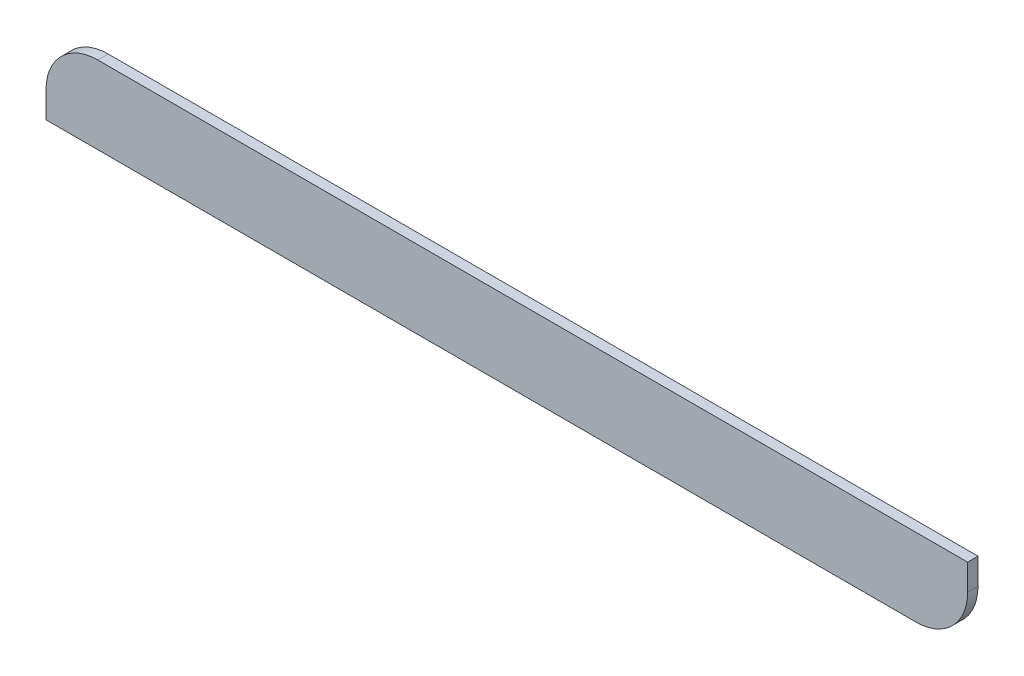
ISO-10303-21;
HEADER;
FILE_DESCRIPTION(('STEP AP214'),'2;1');
FILE_NAME('part.step','',(''),(''),'','','');
FILE_SCHEMA(('AUTOMOTIVE_DESIGN { 1 0 10303 214 1 1 1 1 }'));
ENDSEC;
DATA;
#1=APPLICATION_CONTEXT('core data for automotive mechanical design processes');
#2=APPLICATION_PROTOCOL_DEFINITION('international standard','automotive_design',2000,#1);
#3=PRODUCT_CONTEXT('',#1,'mechanical');
#4=PRODUCT('Part','Part','',(#3));
#5=PRODUCT_RELATED_PRODUCT_CATEGORY('part','',(#4));
#6=PRODUCT_DEFINITION_FORMATION('','',#4);
#7=PRODUCT_DEFINITION_CONTEXT('part definition',#1,'design');
#8=PRODUCT_DEFINITION('design','',#6,#7);
#9=PRODUCT_DEFINITION_SHAPE('','',#8);
#10=(LENGTH_UNIT() NAMED_UNIT(*) SI_UNIT(.MILLI.,.METRE.));
#11=(NAMED_UNIT(*) PLANE_ANGLE_UNIT() SI_UNIT($,.RADIAN.));
#12=(NAMED_UNIT(*) SI_UNIT($,.STERADIAN.) SOLID_ANGLE_UNIT());
#13=UNCERTAINTY_MEASURE_WITH_UNIT(LENGTH_MEASURE(1.E-05),#10,'distance_accuracy_value','');
#14=(GEOMETRIC_REPRESENTATION_CONTEXT(3) GLOBAL_UNCERTAINTY_ASSIGNED_CONTEXT((#13)) GLOBAL_UNIT_ASSIGNED_CONTEXT((#10,
#11,#12)) REPRESENTATION_CONTEXT('',''));
#15=CARTESIAN_POINT('',(0.,0.,0.));
#16=DIRECTION('',(0.,0.,1.));
#17=DIRECTION('',(1.,0.,0.));
#18=AXIS2_PLACEMENT_3D('',#15,#16,#17);
#19=CARTESIAN_POINT('',(-160.973915688566,-16.8619186731065,2.));
#20=DIRECTION('',(0.,0.,-1.));
#21=DIRECTION('',(-1.,0.,0.));
#22=AXIS2_PLACEMENT_3D('',#19,#20,#21);
#23=CYLINDRICAL_SURFACE('',#22,10.);
#24=CARTESIAN_POINT('',(-160.973915688566,-16.8619186731065,0.));
#25=DIRECTION('',(0.,0.,1.));
#26=DIRECTION('',(1.,0.,0.));
#27=AXIS2_PLACEMENT_3D('',#24,#25,#26);
#28=CIRCLE('',#27,10.);
#29=CARTESIAN_POINT('',(-160.973915688566,-6.86191867310647,0.));
#30=VERTEX_POINT('',#29);
#31=CARTESIAN_POINT('',(-170.973915688566,-16.8619186731065,0.));
#32=VERTEX_POINT('',#31);
#33=EDGE_CURVE('E119',#30,#32,#28,.T.);
#34=ORIENTED_EDGE('',*,*,#33,.T.);
#35=DIRECTION('',(0.,0.,-1.));
#36=VECTOR('',#35,1.);
#37=CARTESIAN_POINT('',(-170.973915688566,-16.8619186731065,2.));
#38=LINE('',#37,#36);
#39=CARTESIAN_POINT('',(-170.973915688566,-16.8619186731065,2.));
#40=VERTEX_POINT('',#39);
#41=EDGE_CURVE('E11',#40,#32,#38,.T.);
#42=ORIENTED_EDGE('',*,*,#41,.F.);
#43=CARTESIAN_POINT('',(-160.973915688566,-16.8619186731065,2.));
#44=DIRECTION('',(0.,0.,1.));
#45=DIRECTION('',(1.,0.,0.));
#46=AXIS2_PLACEMENT_3D('',#43,#44,#45);
#47=CIRCLE('',#46,10.);
#48=CARTESIAN_POINT('',(-160.973915688566,-6.86191867310647,2.));
#49=VERTEX_POINT('',#48);
#50=EDGE_CURVE('E131',#49,#40,#47,.T.);
#51=ORIENTED_EDGE('',*,*,#50,.F.);
#52=DIRECTION('',(0.,0.,-1.));
#53=VECTOR('',#52,1.);
#54=CARTESIAN_POINT('',(-160.973915688566,-6.86191867310647,2.));
#55=LINE('',#54,#53);
#56=EDGE_CURVE('E50',#49,#30,#55,.T.);
#57=ORIENTED_EDGE('',*,*,#56,.T.);
#58=EDGE_LOOP('',(#34,#42,#51,#57));
#59=FACE_BOUND('',#58,.T.);
#60=ADVANCED_FACE('F34',(#59),#23,.T.);
#61=CARTESIAN_POINT('',(-170.973915688566,-16.8619186731065,2.));
#62=DIRECTION('',(1.,0.,0.));
#63=DIRECTION('',(0.,0.,-1.));
#64=AXIS2_PLACEMENT_3D('',#61,#62,#63);
#65=PLANE('',#64);
#66=DIRECTION('',(0.,-1.,0.));
#67=VECTOR('',#66,1.);
#68=CARTESIAN_POINT('',(-170.973915688566,-16.8619186731065,0.));
#69=LINE('',#68,#67);
#70=CARTESIAN_POINT('',(-170.973915688566,-21.8619186731065,0.));
#71=VERTEX_POINT('',#70);
#72=EDGE_CURVE('E121',#32,#71,#69,.T.);
#73=ORIENTED_EDGE('',*,*,#72,.T.);
#74=DIRECTION('',(0.,0.,-1.));
#75=VECTOR('',#74,1.);
#76=CARTESIAN_POINT('',(-170.973915688566,-21.8619186731065,2.));
#77=LINE('',#76,#75);
#78=CARTESIAN_POINT('',(-170.973915688566,-21.8619186731065,2.));
#79=VERTEX_POINT('',#78);
#80=EDGE_CURVE('E42',#79,#71,#77,.T.);
#81=ORIENTED_EDGE('',*,*,#80,.F.);
#82=DIRECTION('',(0.,-1.,0.));
#83=VECTOR('',#82,1.);
#84=CARTESIAN_POINT('',(-170.973915688566,-16.8619186731065,2.));
#85=LINE('',#84,#83);
#86=EDGE_CURVE('E82',#40,#79,#85,.T.);
#87=ORIENTED_EDGE('',*,*,#86,.F.);
#88=ORIENTED_EDGE('',*,*,#41,.T.);
#89=EDGE_LOOP('',(#73,#81,#87,#88));
#90=FACE_BOUND('',#89,.T.);
#91=ADVANCED_FACE('F151',(#90),#65,.F.);
#92=CARTESIAN_POINT('',(-170.973915688566,-21.8619186731065,2.));
#93=DIRECTION('',(0.,1.,0.));
#94=DIRECTION('',(0.,0.,1.));
#95=AXIS2_PLACEMENT_3D('',#92,#93,#94);
#96=PLANE('',#95);
#97=DIRECTION('',(1.,0.,0.));
#98=VECTOR('',#97,1.);
#99=CARTESIAN_POINT('',(-170.973915688566,-21.8619186731065,0.));
#100=LINE('',#99,#98);
#101=CARTESIAN_POINT('',(-3.17391568856599,-21.8619186731065,0.));
#102=VERTEX_POINT('',#101);
#103=EDGE_CURVE('E123',#71,#102,#100,.T.);
#104=ORIENTED_EDGE('',*,*,#103,.T.);
#105=DIRECTION('',(0.,0.,-1.));
#106=VECTOR('',#105,1.);
#107=CARTESIAN_POINT('',(-3.17391568856599,-21.8619186731065,2.));
#108=LINE('',#107,#106);
#109=CARTESIAN_POINT('',(-3.17391568856599,-21.8619186731065,2.));
#110=VERTEX_POINT('',#109);
#111=EDGE_CURVE('E111',#110,#102,#108,.T.);
#112=ORIENTED_EDGE('',*,*,#111,.F.);
#113=DIRECTION('',(1.,0.,0.));
#114=VECTOR('',#113,1.);
#115=CARTESIAN_POINT('',(-170.973915688566,-21.8619186731065,2.));
#116=LINE('',#115,#114);
#117=EDGE_CURVE('E99',#79,#110,#116,.T.);
#118=ORIENTED_EDGE('',*,*,#117,.F.);
#119=ORIENTED_EDGE('',*,*,#80,.T.);
#120=EDGE_LOOP('',(#104,#112,#118,#119));
#121=FACE_BOUND('',#120,.T.);
#122=ADVANCED_FACE('F137',(#121),#96,.F.);
#123=CARTESIAN_POINT('',(-3.17391568856592,-11.8619186731065,2.));
#124=DIRECTION('',(0.,0.,-1.));
#125=DIRECTION('',(-1.,0.,0.));
#126=AXIS2_PLACEMENT_3D('',#123,#124,#125);
#127=CYLINDRICAL_SURFACE('',#126,10.);
#128=CARTESIAN_POINT('',(-3.17391568856592,-11.8619186731065,0.));
#129=DIRECTION('',(0.,0.,1.));
#130=DIRECTION('',(1.,0.,0.));
#131=AXIS2_PLACEMENT_3D('',#128,#129,#130);
#132=CIRCLE('',#131,10.);
#133=CARTESIAN_POINT('',(6.82608431143408,-11.8619186731064,0.));
#134=VERTEX_POINT('',#133);
#135=EDGE_CURVE('E108',#102,#134,#132,.T.);
#136=ORIENTED_EDGE('',*,*,#135,.T.);
#137=DIRECTION('',(0.,0.,-1.));
#138=VECTOR('',#137,1.);
#139=CARTESIAN_POINT('',(6.82608431143408,-11.8619186731064,2.));
#140=LINE('',#139,#138);
#141=CARTESIAN_POINT('',(6.82608431143408,-11.8619186731064,2.));
#142=VERTEX_POINT('',#141);
#143=EDGE_CURVE('E105',#142,#134,#140,.T.);
#144=ORIENTED_EDGE('',*,*,#143,.F.);
#145=CARTESIAN_POINT('',(-3.17391568856592,-11.8619186731065,2.));
#146=DIRECTION('',(0.,0.,1.));
#147=DIRECTION('',(1.,0.,0.));
#148=AXIS2_PLACEMENT_3D('',#145,#146,#147);
#149=CIRCLE('',#148,10.);
#150=EDGE_CURVE('E92',#110,#142,#149,.T.);
#151=ORIENTED_EDGE('',*,*,#150,.F.);
#152=ORIENTED_EDGE('',*,*,#111,.T.);
#153=EDGE_LOOP('',(#136,#144,#151,#152));
#154=FACE_BOUND('',#153,.T.);
#155=ADVANCED_FACE('F106',(#154),#127,.T.);
#156=CARTESIAN_POINT('',(6.82608431143408,-6.86191867310647,2.));
#157=DIRECTION('',(1.,0.,0.));
#158=DIRECTION('',(0.,0.,-1.));
#159=AXIS2_PLACEMENT_3D('',#156,#157,#158);
#160=PLANE('',#159);
#161=DIRECTION('',(0.,-1.,0.));
#162=VECTOR('',#161,1.);
#163=CARTESIAN_POINT('',(6.82608431143408,-6.86191867310647,0.));
#164=LINE('',#163,#162);
#165=CARTESIAN_POINT('',(6.82608431143408,-6.86191867310647,0.));
#166=VERTEX_POINT('',#165);
#167=EDGE_CURVE('E126',#166,#134,#164,.T.);
#168=ORIENTED_EDGE('',*,*,#167,.F.);
#169=DIRECTION('',(0.,0.,-1.));
#170=VECTOR('',#169,1.);
#171=CARTESIAN_POINT('',(6.82608431143408,-6.86191867310647,2.));
#172=LINE('',#171,#170);
#173=CARTESIAN_POINT('',(6.82608431143408,-6.86191867310647,2.));
#174=VERTEX_POINT('',#173);
#175=EDGE_CURVE('E70',#174,#166,#172,.T.);
#176=ORIENTED_EDGE('',*,*,#175,.F.);
#177=DIRECTION('',(0.,-1.,0.));
#178=VECTOR('',#177,1.);
#179=CARTESIAN_POINT('',(6.82608431143408,-6.86191867310647,2.));
#180=LINE('',#179,#178);
#181=EDGE_CURVE('E97',#174,#142,#180,.T.);
#182=ORIENTED_EDGE('',*,*,#181,.T.);
#183=ORIENTED_EDGE('',*,*,#143,.T.);
#184=EDGE_LOOP('',(#168,#176,#182,#183));
#185=FACE_BOUND('',#184,.T.);
#186=ADVANCED_FACE('F113',(#185),#160,.T.);
#187=CARTESIAN_POINT('',(-160.973915688566,-6.86191867310647,2.));
#188=DIRECTION('',(0.,1.,0.));
#189=DIRECTION('',(0.,0.,1.));
#190=AXIS2_PLACEMENT_3D('',#187,#188,#189);
#191=PLANE('',#190);
#192=DIRECTION('',(1.,0.,0.));
#193=VECTOR('',#192,1.);
#194=CARTESIAN_POINT('',(-160.973915688566,-6.86191867310647,0.));
#195=LINE('',#194,#193);
#196=EDGE_CURVE('E128',#30,#166,#195,.T.);
#197=ORIENTED_EDGE('',*,*,#196,.F.);
#198=ORIENTED_EDGE('',*,*,#56,.F.);
#199=DIRECTION('',(1.,0.,0.));
#200=VECTOR('',#199,1.);
#201=CARTESIAN_POINT('',(-160.973915688566,-6.86191867310647,2.));
#202=LINE('',#201,#200);
#203=EDGE_CURVE('E114',#49,#174,#202,.T.);
#204=ORIENTED_EDGE('',*,*,#203,.T.);
#205=ORIENTED_EDGE('',*,*,#175,.T.);
#206=EDGE_LOOP('',(#197,#198,#204,#205));
#207=FACE_BOUND('',#206,.T.);
#208=ADVANCED_FACE('F140',(#207),#191,.T.);
#209=CARTESIAN_POINT('',(-160.973915688566,-16.8619186731065,2.));
#210=DIRECTION('',(0.,0.,1.));
#211=DIRECTION('',(1.,0.,0.));
#212=AXIS2_PLACEMENT_3D('',#209,#210,#211);
#213=PLANE('',#212);
#214=ORIENTED_EDGE('',*,*,#50,.T.);
#215=ORIENTED_EDGE('',*,*,#86,.T.);
#216=ORIENTED_EDGE('',*,*,#117,.T.);
#217=ORIENTED_EDGE('',*,*,#150,.T.);
#218=ORIENTED_EDGE('',*,*,#181,.F.);
#219=ORIENTED_EDGE('',*,*,#203,.F.);
#220=EDGE_LOOP('',(#214,#215,#216,#217,#218,#219));
#221=FACE_BOUND('',#220,.T.);
#222=ADVANCED_FACE('F94',(#221),#213,.T.);
#223=CARTESIAN_POINT('',(-160.973915688566,-16.8619186731065,0.));
#224=DIRECTION('',(0.,0.,1.));
#225=DIRECTION('',(1.,0.,0.));
#226=AXIS2_PLACEMENT_3D('',#223,#224,#225);
#227=PLANE('',#226);
#228=ORIENTED_EDGE('',*,*,#33,.F.);
#229=ORIENTED_EDGE('',*,*,#196,.T.);
#230=ORIENTED_EDGE('',*,*,#167,.T.);
#231=ORIENTED_EDGE('',*,*,#135,.F.);
#232=ORIENTED_EDGE('',*,*,#103,.F.);
#233=ORIENTED_EDGE('',*,*,#72,.F.);
#234=EDGE_LOOP('',(#228,#229,#230,#231,#232,#233));
#235=FACE_BOUND('',#234,.T.);
#236=ADVANCED_FACE('F139',(#235),#227,.F.);
#237=CLOSED_SHELL('',(#60,#91,#122,#155,#186,#208,#222,#236));
#238=MANIFOLD_SOLID_BREP('B2',#237);
#239=ADVANCED_BREP_SHAPE_REPRESENTATION('',(#18,#238),#14);
#240=SHAPE_DEFINITION_REPRESENTATION(#9,#239);
ENDSEC;
END-ISO-10303-21;
